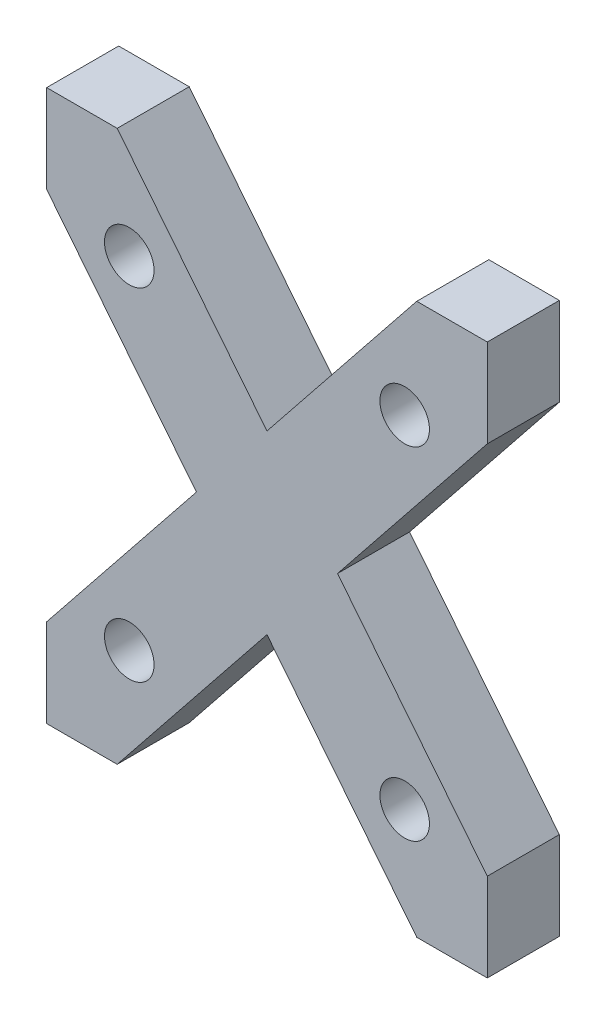
ISO-10303-21;
HEADER;
FILE_DESCRIPTION(('STEP AP214'),'2;1');
FILE_NAME('part.step','',(''),(''),'','','');
FILE_SCHEMA(('AUTOMOTIVE_DESIGN { 1 0 10303 214 1 1 1 1 }'));
ENDSEC;
DATA;
#1=APPLICATION_CONTEXT('core data for automotive mechanical design processes');
#2=APPLICATION_PROTOCOL_DEFINITION('international standard','automotive_design',2000,#1);
#3=PRODUCT_CONTEXT('',#1,'mechanical');
#4=PRODUCT('Part','Part','',(#3));
#5=PRODUCT_RELATED_PRODUCT_CATEGORY('part','',(#4));
#6=PRODUCT_DEFINITION_FORMATION('','',#4);
#7=PRODUCT_DEFINITION_CONTEXT('part definition',#1,'design');
#8=PRODUCT_DEFINITION('design','',#6,#7);
#9=PRODUCT_DEFINITION_SHAPE('','',#8);
#10=(LENGTH_UNIT() NAMED_UNIT(*) SI_UNIT(.MILLI.,.METRE.));
#11=(NAMED_UNIT(*) PLANE_ANGLE_UNIT() SI_UNIT($,.RADIAN.));
#12=(NAMED_UNIT(*) SI_UNIT($,.STERADIAN.) SOLID_ANGLE_UNIT());
#13=UNCERTAINTY_MEASURE_WITH_UNIT(LENGTH_MEASURE(1.E-05),#10,'distance_accuracy_value','');
#14=(GEOMETRIC_REPRESENTATION_CONTEXT(3) GLOBAL_UNCERTAINTY_ASSIGNED_CONTEXT((#13)) GLOBAL_UNIT_ASSIGNED_CONTEXT((#10,
#11,#12)) REPRESENTATION_CONTEXT('',''));
#15=CARTESIAN_POINT('',(0.,0.,0.));
#16=DIRECTION('',(0.,0.,1.));
#17=DIRECTION('',(1.,0.,0.));
#18=AXIS2_PLACEMENT_3D('',#15,#16,#17);
#19=CARTESIAN_POINT('',(20.,-25.,6.54));
#20=DIRECTION('',(-1.,0.,0.));
#21=DIRECTION('',(0.,0.,1.));
#22=AXIS2_PLACEMENT_3D('',#19,#20,#21);
#23=PLANE('',#22);
#24=DIRECTION('',(0.,1.,0.));
#25=VECTOR('',#24,1.);
#26=CARTESIAN_POINT('',(20.,-25.,6.54));
#27=LINE('',#26,#25);
#28=CARTESIAN_POINT('',(20.,16.9960947032089,6.54));
#29=VERTEX_POINT('',#28);
#30=CARTESIAN_POINT('',(20.,25.,6.54));
#31=VERTEX_POINT('',#30);
#32=EDGE_CURVE('E297',#29,#31,#27,.T.);
#33=ORIENTED_EDGE('',*,*,#32,.F.);
#34=DIRECTION('',(0.,0.,-1.));
#35=VECTOR('',#34,1.);
#36=CARTESIAN_POINT('',(20.,16.9960947032089,6.54));
#37=LINE('',#36,#35);
#38=CARTESIAN_POINT('',(20.,16.9960947032089,0.));
#39=VERTEX_POINT('',#38);
#40=EDGE_CURVE('E196',#29,#39,#37,.T.);
#41=ORIENTED_EDGE('',*,*,#40,.T.);
#42=DIRECTION('',(0.,1.,0.));
#43=VECTOR('',#42,1.);
#44=CARTESIAN_POINT('',(20.,-25.,0.));
#45=LINE('',#44,#43);
#46=CARTESIAN_POINT('',(20.,25.,0.));
#47=VERTEX_POINT('',#46);
#48=EDGE_CURVE('E291',#39,#47,#45,.T.);
#49=ORIENTED_EDGE('',*,*,#48,.T.);
#50=DIRECTION('',(0.,0.,-1.));
#51=VECTOR('',#50,1.);
#52=CARTESIAN_POINT('',(20.,25.,6.54));
#53=LINE('',#52,#51);
#54=EDGE_CURVE('E11',#31,#47,#53,.T.);
#55=ORIENTED_EDGE('',*,*,#54,.F.);
#56=EDGE_LOOP('',(#33,#41,#49,#55));
#57=FACE_BOUND('',#56,.T.);
#58=ADVANCED_FACE('F39',(#57),#23,.F.);
#59=CARTESIAN_POINT('',(-20.,25.,6.54));
#60=DIRECTION('',(0.,-1.,0.));
#61=DIRECTION('',(0.,0.,-1.));
#62=AXIS2_PLACEMENT_3D('',#59,#60,#61);
#63=PLANE('',#62);
#64=DIRECTION('',(-1.,0.,0.));
#65=VECTOR('',#64,1.);
#66=CARTESIAN_POINT('',(-20.,25.,0.));
#67=LINE('',#66,#65);
#68=CARTESIAN_POINT('',(13.5968757625671,25.,0.));
#69=VERTEX_POINT('',#68);
#70=EDGE_CURVE('E316',#47,#69,#67,.T.);
#71=ORIENTED_EDGE('',*,*,#70,.T.);
#72=DIRECTION('',(0.,0.,-1.));
#73=VECTOR('',#72,1.);
#74=CARTESIAN_POINT('',(13.5968757625671,25.,6.54));
#75=LINE('',#74,#73);
#76=CARTESIAN_POINT('',(13.5968757625671,25.,6.54));
#77=VERTEX_POINT('',#76);
#78=EDGE_CURVE('E182',#77,#69,#75,.T.);
#79=ORIENTED_EDGE('',*,*,#78,.F.);
#80=DIRECTION('',(-1.,0.,0.));
#81=VECTOR('',#80,1.);
#82=CARTESIAN_POINT('',(-20.,25.,6.54));
#83=LINE('',#82,#81);
#84=EDGE_CURVE('E173',#31,#77,#83,.T.);
#85=ORIENTED_EDGE('',*,*,#84,.F.);
#86=ORIENTED_EDGE('',*,*,#54,.T.);
#87=EDGE_LOOP('',(#71,#79,#85,#86));
#88=FACE_BOUND('',#87,.T.);
#89=ADVANCED_FACE('F372',(#88),#63,.F.);
#90=CARTESIAN_POINT('',(-20.,-25.,6.54));
#91=DIRECTION('',(1.,0.,0.));
#92=DIRECTION('',(0.,0.,-1.));
#93=AXIS2_PLACEMENT_3D('',#90,#91,#92);
#94=PLANE('',#93);
#95=DIRECTION('',(0.,-1.,0.));
#96=VECTOR('',#95,1.);
#97=CARTESIAN_POINT('',(-20.,-25.,0.));
#98=LINE('',#97,#96);
#99=CARTESIAN_POINT('',(-20.,25.,0.));
#100=VERTEX_POINT('',#99);
#101=CARTESIAN_POINT('',(-20.,16.9960947032089,0.));
#102=VERTEX_POINT('',#101);
#103=EDGE_CURVE('E321',#100,#102,#98,.T.);
#104=ORIENTED_EDGE('',*,*,#103,.T.);
#105=DIRECTION('',(0.,0.,-1.));
#106=VECTOR('',#105,1.);
#107=CARTESIAN_POINT('',(-20.,16.9960947032089,6.54));
#108=LINE('',#107,#106);
#109=CARTESIAN_POINT('',(-20.,16.9960947032089,6.54));
#110=VERTEX_POINT('',#109);
#111=EDGE_CURVE('E249',#110,#102,#108,.T.);
#112=ORIENTED_EDGE('',*,*,#111,.F.);
#113=DIRECTION('',(0.,-1.,0.));
#114=VECTOR('',#113,1.);
#115=CARTESIAN_POINT('',(-20.,-25.,6.54));
#116=LINE('',#115,#114);
#117=CARTESIAN_POINT('',(-20.,25.,6.54));
#118=VERTEX_POINT('',#117);
#119=EDGE_CURVE('E301',#118,#110,#116,.T.);
#120=ORIENTED_EDGE('',*,*,#119,.F.);
#121=DIRECTION('',(0.,0.,-1.));
#122=VECTOR('',#121,1.);
#123=CARTESIAN_POINT('',(-20.,25.,6.54));
#124=LINE('',#123,#122);
#125=EDGE_CURVE('E48',#118,#100,#124,.T.);
#126=ORIENTED_EDGE('',*,*,#125,.T.);
#127=EDGE_LOOP('',(#104,#112,#120,#126));
#128=FACE_BOUND('',#127,.T.);
#129=ADVANCED_FACE('F342',(#128),#94,.F.);
#130=CARTESIAN_POINT('',(-20.,-25.,6.54));
#131=DIRECTION('',(0.,1.,0.));
#132=DIRECTION('',(0.,0.,1.));
#133=AXIS2_PLACEMENT_3D('',#130,#131,#132);
#134=PLANE('',#133);
#135=DIRECTION('',(1.,0.,0.));
#136=VECTOR('',#135,1.);
#137=CARTESIAN_POINT('',(-20.,-25.,0.));
#138=LINE('',#137,#136);
#139=CARTESIAN_POINT('',(-20.,-25.,0.));
#140=VERTEX_POINT('',#139);
#141=CARTESIAN_POINT('',(-13.5968757625672,-25.,0.));
#142=VERTEX_POINT('',#141);
#143=EDGE_CURVE('E326',#140,#142,#138,.T.);
#144=ORIENTED_EDGE('',*,*,#143,.T.);
#145=DIRECTION('',(0.,0.,-1.));
#146=VECTOR('',#145,1.);
#147=CARTESIAN_POINT('',(-13.5968757625672,-25.,6.54));
#148=LINE('',#147,#146);
#149=CARTESIAN_POINT('',(-13.5968757625672,-25.,6.54));
#150=VERTEX_POINT('',#149);
#151=EDGE_CURVE('E225',#150,#142,#148,.T.);
#152=ORIENTED_EDGE('',*,*,#151,.F.);
#153=DIRECTION('',(1.,0.,0.));
#154=VECTOR('',#153,1.);
#155=CARTESIAN_POINT('',(-20.,-25.,6.54));
#156=LINE('',#155,#154);
#157=CARTESIAN_POINT('',(-20.,-25.,6.54));
#158=VERTEX_POINT('',#157);
#159=EDGE_CURVE('E306',#158,#150,#156,.T.);
#160=ORIENTED_EDGE('',*,*,#159,.F.);
#161=DIRECTION('',(0.,0.,-1.));
#162=VECTOR('',#161,1.);
#163=CARTESIAN_POINT('',(-20.,-25.,6.54));
#164=LINE('',#163,#162);
#165=EDGE_CURVE('E333',#158,#140,#164,.T.);
#166=ORIENTED_EDGE('',*,*,#165,.T.);
#167=EDGE_LOOP('',(#144,#152,#160,#166));
#168=FACE_BOUND('',#167,.T.);
#169=ADVANCED_FACE('F379',(#168),#134,.F.);
#170=CARTESIAN_POINT('',(20.,-25.,0.));
#171=VERTEX_POINT('',#170);
#172=CARTESIAN_POINT('',(20.,-16.9960947032089,0.));
#173=VERTEX_POINT('',#172);
#174=EDGE_CURVE('E311',#171,#173,#45,.T.);
#175=ORIENTED_EDGE('',*,*,#174,.T.);
#176=DIRECTION('',(0.,0.,-1.));
#177=VECTOR('',#176,1.);
#178=CARTESIAN_POINT('',(20.,-16.9960947032089,6.54));
#179=LINE('',#178,#177);
#180=CARTESIAN_POINT('',(20.,-16.9960947032089,6.54));
#181=VERTEX_POINT('',#180);
#182=EDGE_CURVE('E205',#181,#173,#179,.T.);
#183=ORIENTED_EDGE('',*,*,#182,.F.);
#184=CARTESIAN_POINT('',(20.,-25.,6.54));
#185=VERTEX_POINT('',#184);
#186=EDGE_CURVE('E292',#185,#181,#27,.T.);
#187=ORIENTED_EDGE('',*,*,#186,.F.);
#188=DIRECTION('',(0.,0.,-1.));
#189=VECTOR('',#188,1.);
#190=CARTESIAN_POINT('',(20.,-25.,6.54));
#191=LINE('',#190,#189);
#192=EDGE_CURVE('E310',#185,#171,#191,.T.);
#193=ORIENTED_EDGE('',*,*,#192,.T.);
#194=EDGE_LOOP('',(#175,#183,#187,#193));
#195=FACE_BOUND('',#194,.T.);
#196=ADVANCED_FACE('F41',(#195),#23,.F.);
#197=CARTESIAN_POINT('',(-13.5968757625672,25.,6.54));
#198=VERTEX_POINT('',#197);
#199=EDGE_CURVE('E296',#198,#118,#83,.T.);
#200=ORIENTED_EDGE('',*,*,#199,.F.);
#201=DIRECTION('',(0.,0.,-1.));
#202=VECTOR('',#201,1.);
#203=CARTESIAN_POINT('',(-13.5968757625672,25.,6.54));
#204=LINE('',#203,#202);
#205=CARTESIAN_POINT('',(-13.5968757625672,25.,0.));
#206=VERTEX_POINT('',#205);
#207=EDGE_CURVE('E159',#198,#206,#204,.T.);
#208=ORIENTED_EDGE('',*,*,#207,.T.);
#209=EDGE_CURVE('E315',#206,#100,#67,.T.);
#210=ORIENTED_EDGE('',*,*,#209,.T.);
#211=ORIENTED_EDGE('',*,*,#125,.F.);
#212=EDGE_LOOP('',(#200,#208,#210,#211));
#213=FACE_BOUND('',#212,.T.);
#214=ADVANCED_FACE('F374',(#213),#63,.F.);
#215=CARTESIAN_POINT('',(-20.,-16.9960947032089,6.54));
#216=VERTEX_POINT('',#215);
#217=EDGE_CURVE('E300',#216,#158,#116,.T.);
#218=ORIENTED_EDGE('',*,*,#217,.F.);
#219=DIRECTION('',(0.,0.,-1.));
#220=VECTOR('',#219,1.);
#221=CARTESIAN_POINT('',(-20.,-16.9960947032089,6.54));
#222=LINE('',#221,#220);
#223=CARTESIAN_POINT('',(-20.,-16.9960947032089,0.));
#224=VERTEX_POINT('',#223);
#225=EDGE_CURVE('E253',#216,#224,#222,.T.);
#226=ORIENTED_EDGE('',*,*,#225,.T.);
#227=EDGE_CURVE('E320',#224,#140,#98,.T.);
#228=ORIENTED_EDGE('',*,*,#227,.T.);
#229=ORIENTED_EDGE('',*,*,#165,.F.);
#230=EDGE_LOOP('',(#218,#226,#228,#229));
#231=FACE_BOUND('',#230,.T.);
#232=ADVANCED_FACE('F381',(#231),#94,.F.);
#233=CARTESIAN_POINT('',(13.5968757625672,-25.,6.54));
#234=VERTEX_POINT('',#233);
#235=EDGE_CURVE('E305',#234,#185,#156,.T.);
#236=ORIENTED_EDGE('',*,*,#235,.F.);
#237=DIRECTION('',(0.,0.,-1.));
#238=VECTOR('',#237,1.);
#239=CARTESIAN_POINT('',(13.5968757625672,-25.,6.54));
#240=LINE('',#239,#238);
#241=CARTESIAN_POINT('',(13.5968757625672,-25.,0.));
#242=VERTEX_POINT('',#241);
#243=EDGE_CURVE('E229',#234,#242,#240,.T.);
#244=ORIENTED_EDGE('',*,*,#243,.T.);
#245=EDGE_CURVE('E325',#242,#171,#138,.T.);
#246=ORIENTED_EDGE('',*,*,#245,.T.);
#247=ORIENTED_EDGE('',*,*,#192,.F.);
#248=EDGE_LOOP('',(#236,#244,#246,#247));
#249=FACE_BOUND('',#248,.T.);
#250=ADVANCED_FACE('F387',(#249),#134,.F.);
#251=CARTESIAN_POINT('',(0.,0.,6.54));
#252=DIRECTION('',(0.,0.,-1.));
#253=DIRECTION('',(-1.,0.,0.));
#254=AXIS2_PLACEMENT_3D('',#251,#252,#253);
#255=PLANE('',#254);
#256=CARTESIAN_POINT('',(12.5,15.5,6.54));
#257=DIRECTION('',(0.,0.,-1.));
#258=DIRECTION('',(-1.,0.,0.));
#259=AXIS2_PLACEMENT_3D('',#256,#257,#258);
#260=CIRCLE('',#259,2.25);
#261=CARTESIAN_POINT('',(10.25,15.5,6.54));
#262=VERTEX_POINT('',#261);
#263=EDGE_CURVE('E263',#262,#262,#260,.T.);
#264=ORIENTED_EDGE('',*,*,#263,.T.);
#265=EDGE_LOOP('',(#264));
#266=FACE_BOUND('',#265,.T.);
#267=CARTESIAN_POINT('',(-12.5,15.5,6.54));
#268=DIRECTION('',(0.,0.,-1.));
#269=DIRECTION('',(-1.,0.,0.));
#270=AXIS2_PLACEMENT_3D('',#267,#268,#269);
#271=CIRCLE('',#270,2.25);
#272=CARTESIAN_POINT('',(-14.75,15.5,6.54));
#273=VERTEX_POINT('',#272);
#274=EDGE_CURVE('E271',#273,#273,#271,.T.);
#275=ORIENTED_EDGE('',*,*,#274,.T.);
#276=EDGE_LOOP('',(#275));
#277=FACE_BOUND('',#276,.T.);
#278=CARTESIAN_POINT('',(-12.5,-15.5,6.54));
#279=DIRECTION('',(0.,0.,-1.));
#280=DIRECTION('',(-1.,0.,0.));
#281=AXIS2_PLACEMENT_3D('',#278,#279,#280);
#282=CIRCLE('',#281,2.25);
#283=CARTESIAN_POINT('',(-14.75,-15.5,6.54));
#284=VERTEX_POINT('',#283);
#285=EDGE_CURVE('E279',#284,#284,#282,.T.);
#286=ORIENTED_EDGE('',*,*,#285,.T.);
#287=EDGE_LOOP('',(#286));
#288=FACE_BOUND('',#287,.T.);
#289=CARTESIAN_POINT('',(12.5,-15.5,6.54));
#290=DIRECTION('',(0.,0.,-1.));
#291=DIRECTION('',(-1.,0.,0.));
#292=AXIS2_PLACEMENT_3D('',#289,#290,#291);
#293=CIRCLE('',#292,2.25);
#294=CARTESIAN_POINT('',(10.25,-15.5,6.54));
#295=VERTEX_POINT('',#294);
#296=EDGE_CURVE('E287',#295,#295,#293,.T.);
#297=ORIENTED_EDGE('',*,*,#296,.T.);
#298=EDGE_LOOP('',(#297));
#299=FACE_BOUND('',#298,.T.);
#300=DIRECTION('',(-0.624695047554425,0.78086880944303,0.));
#301=VECTOR('',#300,1.);
#302=CARTESIAN_POINT('',(20.,-16.9960947032089,6.54));
#303=LINE('',#302,#301);
#304=CARTESIAN_POINT('',(6.40312423743284,0.,6.54));
#305=VERTEX_POINT('',#304);
#306=EDGE_CURVE('E192',#181,#305,#303,.T.);
#307=ORIENTED_EDGE('',*,*,#306,.T.);
#308=DIRECTION('',(0.624695047554424,0.78086880944303,0.));
#309=VECTOR('',#308,1.);
#310=CARTESIAN_POINT('',(6.40312423743284,0.,6.54));
#311=LINE('',#310,#309);
#312=EDGE_CURVE('E188',#305,#29,#311,.T.);
#313=ORIENTED_EDGE('',*,*,#312,.T.);
#314=ORIENTED_EDGE('',*,*,#32,.T.);
#315=ORIENTED_EDGE('',*,*,#84,.T.);
#316=DIRECTION('',(-0.624695047554424,-0.78086880944303,0.));
#317=VECTOR('',#316,1.);
#318=CARTESIAN_POINT('',(0.,8.00390529679106,6.54));
#319=LINE('',#318,#317);
#320=CARTESIAN_POINT('',(0.,8.00390529679106,6.54));
#321=VERTEX_POINT('',#320);
#322=EDGE_CURVE('E154',#77,#321,#319,.T.);
#323=ORIENTED_EDGE('',*,*,#322,.T.);
#324=DIRECTION('',(-0.624695047554425,0.78086880944303,0.));
#325=VECTOR('',#324,1.);
#326=CARTESIAN_POINT('',(-13.5968757625672,25.,6.54));
#327=LINE('',#326,#325);
#328=EDGE_CURVE('E160',#321,#198,#327,.T.);
#329=ORIENTED_EDGE('',*,*,#328,.T.);
#330=ORIENTED_EDGE('',*,*,#199,.T.);
#331=ORIENTED_EDGE('',*,*,#119,.T.);
#332=DIRECTION('',(0.624695047554424,-0.78086880944303,0.));
#333=VECTOR('',#332,1.);
#334=CARTESIAN_POINT('',(-6.40312423743285,0.,6.54));
#335=LINE('',#334,#333);
#336=CARTESIAN_POINT('',(-6.40312423743285,0.,6.54));
#337=VERTEX_POINT('',#336);
#338=EDGE_CURVE('E235',#110,#337,#335,.T.);
#339=ORIENTED_EDGE('',*,*,#338,.T.);
#340=DIRECTION('',(-0.624695047554424,-0.78086880944303,0.));
#341=VECTOR('',#340,1.);
#342=CARTESIAN_POINT('',(-20.,-16.9960947032089,6.54));
#343=LINE('',#342,#341);
#344=EDGE_CURVE('E239',#337,#216,#343,.T.);
#345=ORIENTED_EDGE('',*,*,#344,.T.);
#346=ORIENTED_EDGE('',*,*,#217,.T.);
#347=ORIENTED_EDGE('',*,*,#159,.T.);
#348=DIRECTION('',(0.624695047554425,0.78086880944303,0.));
#349=VECTOR('',#348,1.);
#350=CARTESIAN_POINT('',(0.,-8.00390529679106,6.54));
#351=LINE('',#350,#349);
#352=CARTESIAN_POINT('',(0.,-8.00390529679106,6.54));
#353=VERTEX_POINT('',#352);
#354=EDGE_CURVE('E211',#150,#353,#351,.T.);
#355=ORIENTED_EDGE('',*,*,#354,.T.);
#356=DIRECTION('',(0.624695047554424,-0.78086880944303,0.));
#357=VECTOR('',#356,1.);
#358=CARTESIAN_POINT('',(13.5968757625672,-25.,6.54));
#359=LINE('',#358,#357);
#360=EDGE_CURVE('E215',#353,#234,#359,.T.);
#361=ORIENTED_EDGE('',*,*,#360,.T.);
#362=ORIENTED_EDGE('',*,*,#235,.T.);
#363=ORIENTED_EDGE('',*,*,#186,.T.);
#364=EDGE_LOOP('',(#307,#313,#314,#315,#323,#329,#330,#331,#339,#345,#346,#347,#355,#361,#362,#363));
#365=FACE_BOUND('',#364,.T.);
#366=ADVANCED_FACE('F171',(#266,#277,#288,#299,#365),#255,.F.);
#367=CARTESIAN_POINT('',(0.,0.,0.));
#368=DIRECTION('',(0.,0.,-1.));
#369=DIRECTION('',(-1.,0.,0.));
#370=AXIS2_PLACEMENT_3D('',#367,#368,#369);
#371=PLANE('',#370);
#372=DIRECTION('',(0.624695047554424,0.78086880944303,0.));
#373=VECTOR('',#372,1.);
#374=CARTESIAN_POINT('',(6.40312423743284,0.,0.));
#375=LINE('',#374,#373);
#376=CARTESIAN_POINT('',(6.40312423743284,0.,0.));
#377=VERTEX_POINT('',#376);
#378=EDGE_CURVE('E185',#377,#39,#375,.T.);
#379=ORIENTED_EDGE('',*,*,#378,.F.);
#380=DIRECTION('',(-0.624695047554425,0.78086880944303,0.));
#381=VECTOR('',#380,1.);
#382=CARTESIAN_POINT('',(20.,-16.9960947032089,0.));
#383=LINE('',#382,#381);
#384=EDGE_CURVE('E193',#173,#377,#383,.T.);
#385=ORIENTED_EDGE('',*,*,#384,.F.);
#386=ORIENTED_EDGE('',*,*,#174,.F.);
#387=ORIENTED_EDGE('',*,*,#245,.F.);
#388=DIRECTION('',(0.624695047554424,-0.78086880944303,0.));
#389=VECTOR('',#388,1.);
#390=CARTESIAN_POINT('',(13.5968757625672,-25.,0.));
#391=LINE('',#390,#389);
#392=CARTESIAN_POINT('',(0.,-8.00390529679106,0.));
#393=VERTEX_POINT('',#392);
#394=EDGE_CURVE('E216',#393,#242,#391,.T.);
#395=ORIENTED_EDGE('',*,*,#394,.F.);
#396=DIRECTION('',(0.624695047554425,0.78086880944303,0.));
#397=VECTOR('',#396,1.);
#398=CARTESIAN_POINT('',(0.,-8.00390529679106,0.));
#399=LINE('',#398,#397);
#400=EDGE_CURVE('E55',#142,#393,#399,.T.);
#401=ORIENTED_EDGE('',*,*,#400,.F.);
#402=ORIENTED_EDGE('',*,*,#143,.F.);
#403=ORIENTED_EDGE('',*,*,#227,.F.);
#404=DIRECTION('',(-0.624695047554424,-0.78086880944303,0.));
#405=VECTOR('',#404,1.);
#406=CARTESIAN_POINT('',(-20.,-16.9960947032089,0.));
#407=LINE('',#406,#405);
#408=CARTESIAN_POINT('',(-6.40312423743285,0.,0.));
#409=VERTEX_POINT('',#408);
#410=EDGE_CURVE('E240',#409,#224,#407,.T.);
#411=ORIENTED_EDGE('',*,*,#410,.F.);
#412=DIRECTION('',(0.624695047554424,-0.78086880944303,0.));
#413=VECTOR('',#412,1.);
#414=CARTESIAN_POINT('',(-6.40312423743285,0.,0.));
#415=LINE('',#414,#413);
#416=EDGE_CURVE('E228',#102,#409,#415,.T.);
#417=ORIENTED_EDGE('',*,*,#416,.F.);
#418=ORIENTED_EDGE('',*,*,#103,.F.);
#419=ORIENTED_EDGE('',*,*,#209,.F.);
#420=DIRECTION('',(-0.624695047554425,0.78086880944303,0.));
#421=VECTOR('',#420,1.);
#422=CARTESIAN_POINT('',(-13.5968757625672,25.,0.));
#423=LINE('',#422,#421);
#424=CARTESIAN_POINT('',(0.,8.00390529679106,0.));
#425=VERTEX_POINT('',#424);
#426=EDGE_CURVE('E175',#425,#206,#423,.T.);
#427=ORIENTED_EDGE('',*,*,#426,.F.);
#428=DIRECTION('',(-0.624695047554424,-0.78086880944303,0.));
#429=VECTOR('',#428,1.);
#430=CARTESIAN_POINT('',(0.,8.00390529679106,0.));
#431=LINE('',#430,#429);
#432=EDGE_CURVE('E63',#69,#425,#431,.T.);
#433=ORIENTED_EDGE('',*,*,#432,.F.);
#434=ORIENTED_EDGE('',*,*,#70,.F.);
#435=ORIENTED_EDGE('',*,*,#48,.F.);
#436=EDGE_LOOP('',(#379,#385,#386,#387,#395,#401,#402,#403,#411,#417,#418,#419,#427,#433,#434,#435));
#437=FACE_BOUND('',#436,.T.);
#438=CARTESIAN_POINT('',(12.5,15.5,0.));
#439=DIRECTION('',(0.,0.,-1.));
#440=DIRECTION('',(-1.,0.,0.));
#441=AXIS2_PLACEMENT_3D('',#438,#439,#440);
#442=CIRCLE('',#441,2.24999999999999);
#443=CARTESIAN_POINT('',(10.25,15.5,0.));
#444=VERTEX_POINT('',#443);
#445=EDGE_CURVE('E252',#444,#444,#442,.T.);
#446=ORIENTED_EDGE('',*,*,#445,.F.);
#447=EDGE_LOOP('',(#446));
#448=FACE_BOUND('',#447,.T.);
#449=CARTESIAN_POINT('',(-12.5,15.5,0.));
#450=DIRECTION('',(0.,0.,-1.));
#451=DIRECTION('',(-1.,0.,0.));
#452=AXIS2_PLACEMENT_3D('',#449,#450,#451);
#453=CIRCLE('',#452,2.24999999999999);
#454=CARTESIAN_POINT('',(-14.75,15.5,0.));
#455=VERTEX_POINT('',#454);
#456=EDGE_CURVE('E267',#455,#455,#453,.T.);
#457=ORIENTED_EDGE('',*,*,#456,.F.);
#458=EDGE_LOOP('',(#457));
#459=FACE_BOUND('',#458,.T.);
#460=CARTESIAN_POINT('',(-12.5,-15.5,0.));
#461=DIRECTION('',(0.,0.,-1.));
#462=DIRECTION('',(-1.,0.,0.));
#463=AXIS2_PLACEMENT_3D('',#460,#461,#462);
#464=CIRCLE('',#463,2.24999999999999);
#465=CARTESIAN_POINT('',(-14.75,-15.5,0.));
#466=VERTEX_POINT('',#465);
#467=EDGE_CURVE('E275',#466,#466,#464,.T.);
#468=ORIENTED_EDGE('',*,*,#467,.F.);
#469=EDGE_LOOP('',(#468));
#470=FACE_BOUND('',#469,.T.);
#471=CARTESIAN_POINT('',(12.5,-15.5,0.));
#472=DIRECTION('',(0.,0.,-1.));
#473=DIRECTION('',(-1.,0.,0.));
#474=AXIS2_PLACEMENT_3D('',#471,#472,#473);
#475=CIRCLE('',#474,2.24999999999999);
#476=CARTESIAN_POINT('',(10.25,-15.5,0.));
#477=VERTEX_POINT('',#476);
#478=EDGE_CURVE('E283',#477,#477,#475,.T.);
#479=ORIENTED_EDGE('',*,*,#478,.F.);
#480=EDGE_LOOP('',(#479));
#481=FACE_BOUND('',#480,.T.);
#482=ADVANCED_FACE('F349',(#437,#448,#459,#470,#481),#371,.T.);
#483=CARTESIAN_POINT('',(12.5,-15.5,0.));
#484=DIRECTION('',(0.,0.,-1.));
#485=DIRECTION('',(-1.,0.,0.));
#486=AXIS2_PLACEMENT_3D('',#483,#484,#485);
#487=CYLINDRICAL_SURFACE('',#486,2.24999999999999);
#488=ORIENTED_EDGE('',*,*,#296,.F.);
#489=EDGE_LOOP('',(#488));
#490=FACE_BOUND('',#489,.T.);
#491=ORIENTED_EDGE('',*,*,#478,.T.);
#492=EDGE_LOOP('',(#491));
#493=FACE_BOUND('',#492,.T.);
#494=ADVANCED_FACE('F442',(#490,#493),#487,.F.);
#495=CARTESIAN_POINT('',(-12.5,-15.5,0.));
#496=DIRECTION('',(0.,0.,-1.));
#497=DIRECTION('',(-1.,0.,0.));
#498=AXIS2_PLACEMENT_3D('',#495,#496,#497);
#499=CYLINDRICAL_SURFACE('',#498,2.24999999999999);
#500=ORIENTED_EDGE('',*,*,#285,.F.);
#501=EDGE_LOOP('',(#500));
#502=FACE_BOUND('',#501,.T.);
#503=ORIENTED_EDGE('',*,*,#467,.T.);
#504=EDGE_LOOP('',(#503));
#505=FACE_BOUND('',#504,.T.);
#506=ADVANCED_FACE('F438',(#502,#505),#499,.F.);
#507=CARTESIAN_POINT('',(-12.5,15.5,0.));
#508=DIRECTION('',(0.,0.,-1.));
#509=DIRECTION('',(-1.,0.,0.));
#510=AXIS2_PLACEMENT_3D('',#507,#508,#509);
#511=CYLINDRICAL_SURFACE('',#510,2.24999999999999);
#512=ORIENTED_EDGE('',*,*,#274,.F.);
#513=EDGE_LOOP('',(#512));
#514=FACE_BOUND('',#513,.T.);
#515=ORIENTED_EDGE('',*,*,#456,.T.);
#516=EDGE_LOOP('',(#515));
#517=FACE_BOUND('',#516,.T.);
#518=ADVANCED_FACE('F434',(#514,#517),#511,.F.);
#519=CARTESIAN_POINT('',(12.5,15.5,0.));
#520=DIRECTION('',(0.,0.,-1.));
#521=DIRECTION('',(-1.,0.,0.));
#522=AXIS2_PLACEMENT_3D('',#519,#520,#521);
#523=CYLINDRICAL_SURFACE('',#522,2.24999999999999);
#524=ORIENTED_EDGE('',*,*,#263,.F.);
#525=EDGE_LOOP('',(#524));
#526=FACE_BOUND('',#525,.T.);
#527=ORIENTED_EDGE('',*,*,#445,.T.);
#528=EDGE_LOOP('',(#527));
#529=FACE_BOUND('',#528,.T.);
#530=ADVANCED_FACE('F431',(#526,#529),#523,.F.);
#531=CARTESIAN_POINT('',(-6.40312423743285,0.,6.54));
#532=DIRECTION('',(0.78086880944303,0.624695047554425,0.));
#533=DIRECTION('',(-0.624695047554424,0.78086880944303,0.));
#534=AXIS2_PLACEMENT_3D('',#531,#532,#533);
#535=PLANE('',#534);
#536=ORIENTED_EDGE('',*,*,#416,.T.);
#537=DIRECTION('',(0.,0.,-1.));
#538=VECTOR('',#537,1.);
#539=CARTESIAN_POINT('',(-6.40312423743285,0.,6.54));
#540=LINE('',#539,#538);
#541=EDGE_CURVE('E244',#337,#409,#540,.T.);
#542=ORIENTED_EDGE('',*,*,#541,.F.);
#543=ORIENTED_EDGE('',*,*,#338,.F.);
#544=ORIENTED_EDGE('',*,*,#111,.T.);
#545=EDGE_LOOP('',(#536,#542,#543,#544));
#546=FACE_BOUND('',#545,.T.);
#547=ADVANCED_FACE('F354',(#546),#535,.F.);
#548=CARTESIAN_POINT('',(-20.,-16.9960947032089,6.54));
#549=DIRECTION('',(0.78086880944303,-0.624695047554425,0.));
#550=DIRECTION('',(0.624695047554425,0.78086880944303,0.));
#551=AXIS2_PLACEMENT_3D('',#548,#549,#550);
#552=PLANE('',#551);
#553=ORIENTED_EDGE('',*,*,#410,.T.);
#554=ORIENTED_EDGE('',*,*,#225,.F.);
#555=ORIENTED_EDGE('',*,*,#344,.F.);
#556=ORIENTED_EDGE('',*,*,#541,.T.);
#557=EDGE_LOOP('',(#553,#554,#555,#556));
#558=FACE_BOUND('',#557,.T.);
#559=ADVANCED_FACE('F357',(#558),#552,.F.);
#560=CARTESIAN_POINT('',(0.,8.00390529679106,6.54));
#561=DIRECTION('',(0.78086880944303,-0.624695047554424,0.));
#562=DIRECTION('',(0.624695047554424,0.78086880944303,0.));
#563=AXIS2_PLACEMENT_3D('',#560,#561,#562);
#564=PLANE('',#563);
#565=ORIENTED_EDGE('',*,*,#432,.T.);
#566=DIRECTION('',(0.,0.,-1.));
#567=VECTOR('',#566,1.);
#568=CARTESIAN_POINT('',(0.,8.00390529679106,6.54));
#569=LINE('',#568,#567);
#570=EDGE_CURVE('E150',#321,#425,#569,.T.);
#571=ORIENTED_EDGE('',*,*,#570,.F.);
#572=ORIENTED_EDGE('',*,*,#322,.F.);
#573=ORIENTED_EDGE('',*,*,#78,.T.);
#574=EDGE_LOOP('',(#565,#571,#572,#573));
#575=FACE_BOUND('',#574,.T.);
#576=ADVANCED_FACE('F152',(#575),#564,.F.);
#577=CARTESIAN_POINT('',(-13.5968757625672,25.,6.54));
#578=DIRECTION('',(-0.78086880944303,-0.624695047554424,0.));
#579=DIRECTION('',(0.624695047554425,-0.78086880944303,0.));
#580=AXIS2_PLACEMENT_3D('',#577,#578,#579);
#581=PLANE('',#580);
#582=ORIENTED_EDGE('',*,*,#426,.T.);
#583=ORIENTED_EDGE('',*,*,#207,.F.);
#584=ORIENTED_EDGE('',*,*,#328,.F.);
#585=ORIENTED_EDGE('',*,*,#570,.T.);
#586=EDGE_LOOP('',(#582,#583,#584,#585));
#587=FACE_BOUND('',#586,.T.);
#588=ADVANCED_FACE('F163',(#587),#581,.F.);
#589=CARTESIAN_POINT('',(0.,-8.00390529679106,6.54));
#590=DIRECTION('',(-0.78086880944303,0.624695047554425,0.));
#591=DIRECTION('',(-0.624695047554425,-0.78086880944303,0.));
#592=AXIS2_PLACEMENT_3D('',#589,#590,#591);
#593=PLANE('',#592);
#594=ORIENTED_EDGE('',*,*,#400,.T.);
#595=DIRECTION('',(0.,0.,-1.));
#596=VECTOR('',#595,1.);
#597=CARTESIAN_POINT('',(0.,-8.00390529679106,6.54));
#598=LINE('',#597,#596);
#599=EDGE_CURVE('E220',#353,#393,#598,.T.);
#600=ORIENTED_EDGE('',*,*,#599,.F.);
#601=ORIENTED_EDGE('',*,*,#354,.F.);
#602=ORIENTED_EDGE('',*,*,#151,.T.);
#603=EDGE_LOOP('',(#594,#600,#601,#602));
#604=FACE_BOUND('',#603,.T.);
#605=ADVANCED_FACE('F415',(#604),#593,.F.);
#606=CARTESIAN_POINT('',(13.5968757625672,-25.,6.54));
#607=DIRECTION('',(0.78086880944303,0.624695047554425,0.));
#608=DIRECTION('',(-0.624695047554424,0.78086880944303,0.));
#609=AXIS2_PLACEMENT_3D('',#606,#607,#608);
#610=PLANE('',#609);
#611=ORIENTED_EDGE('',*,*,#394,.T.);
#612=ORIENTED_EDGE('',*,*,#243,.F.);
#613=ORIENTED_EDGE('',*,*,#360,.F.);
#614=ORIENTED_EDGE('',*,*,#599,.T.);
#615=EDGE_LOOP('',(#611,#612,#613,#614));
#616=FACE_BOUND('',#615,.T.);
#617=ADVANCED_FACE('F410',(#616),#610,.F.);
#618=CARTESIAN_POINT('',(6.40312423743284,0.,6.54));
#619=DIRECTION('',(-0.78086880944303,0.624695047554425,0.));
#620=DIRECTION('',(-0.624695047554424,-0.78086880944303,0.));
#621=AXIS2_PLACEMENT_3D('',#618,#619,#620);
#622=PLANE('',#621);
#623=ORIENTED_EDGE('',*,*,#378,.T.);
#624=ORIENTED_EDGE('',*,*,#40,.F.);
#625=ORIENTED_EDGE('',*,*,#312,.F.);
#626=DIRECTION('',(0.,0.,-1.));
#627=VECTOR('',#626,1.);
#628=CARTESIAN_POINT('',(6.40312423743284,0.,6.54));
#629=LINE('',#628,#627);
#630=EDGE_CURVE('E202',#305,#377,#629,.T.);
#631=ORIENTED_EDGE('',*,*,#630,.T.);
#632=EDGE_LOOP('',(#623,#624,#625,#631));
#633=FACE_BOUND('',#632,.T.);
#634=ADVANCED_FACE('F422',(#633),#622,.F.);
#635=CARTESIAN_POINT('',(20.,-16.9960947032089,6.54));
#636=DIRECTION('',(-0.78086880944303,-0.624695047554424,0.));
#637=DIRECTION('',(0.624695047554425,-0.78086880944303,0.));
#638=AXIS2_PLACEMENT_3D('',#635,#636,#637);
#639=PLANE('',#638);
#640=ORIENTED_EDGE('',*,*,#384,.T.);
#641=ORIENTED_EDGE('',*,*,#630,.F.);
#642=ORIENTED_EDGE('',*,*,#306,.F.);
#643=ORIENTED_EDGE('',*,*,#182,.T.);
#644=EDGE_LOOP('',(#640,#641,#642,#643));
#645=FACE_BOUND('',#644,.T.);
#646=ADVANCED_FACE('F403',(#645),#639,.F.);
#647=CLOSED_SHELL('',(#58,#89,#129,#169,#196,#214,#232,#250,#366,#482,#494,#506,#518,#530,#547,
#559,#576,#588,#605,#617,#634,#646));
#648=MANIFOLD_SOLID_BREP('B2',#647);
#649=ADVANCED_BREP_SHAPE_REPRESENTATION('',(#18,#648),#14);
#650=SHAPE_DEFINITION_REPRESENTATION(#9,#649);
ENDSEC;
END-ISO-10303-21;
